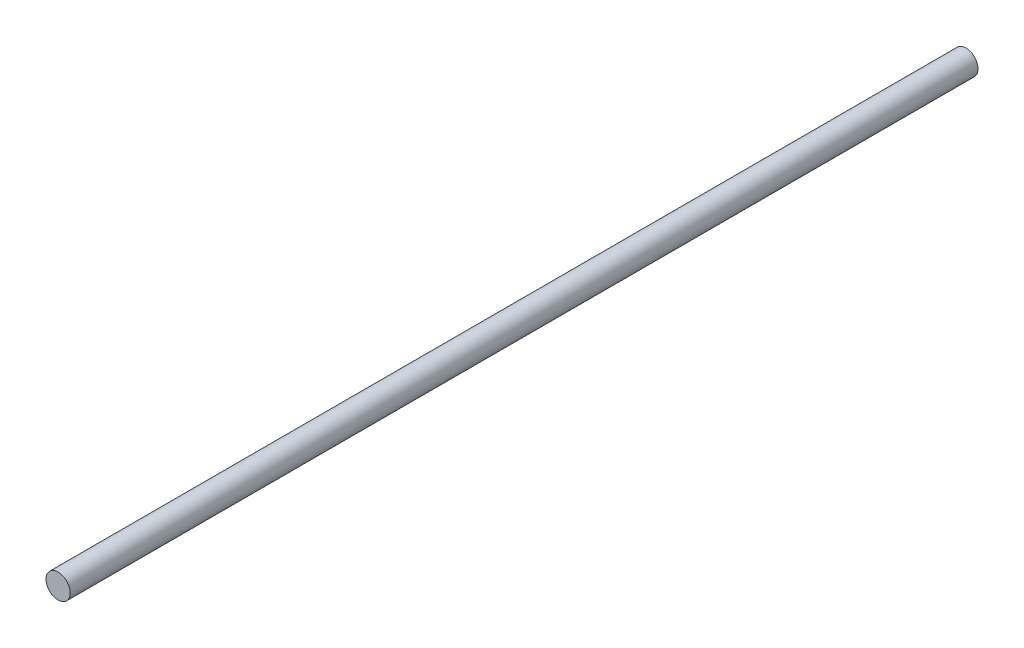
ISO-10303-21;
HEADER;
FILE_DESCRIPTION(('STEP AP214'),'2;1');
FILE_NAME('part.step','',(''),(''),'','','');
FILE_SCHEMA(('AUTOMOTIVE_DESIGN { 1 0 10303 214 1 1 1 1 }'));
ENDSEC;
DATA;
#1=APPLICATION_CONTEXT('core data for automotive mechanical design processes');
#2=APPLICATION_PROTOCOL_DEFINITION('international standard','automotive_design',2000,#1);
#3=PRODUCT_CONTEXT('',#1,'mechanical');
#4=PRODUCT('Part','Part','',(#3));
#5=PRODUCT_RELATED_PRODUCT_CATEGORY('part','',(#4));
#6=PRODUCT_DEFINITION_FORMATION('','',#4);
#7=PRODUCT_DEFINITION_CONTEXT('part definition',#1,'design');
#8=PRODUCT_DEFINITION('design','',#6,#7);
#9=PRODUCT_DEFINITION_SHAPE('','',#8);
#10=(LENGTH_UNIT() NAMED_UNIT(*) SI_UNIT(.MILLI.,.METRE.));
#11=(NAMED_UNIT(*) PLANE_ANGLE_UNIT() SI_UNIT($,.RADIAN.));
#12=(NAMED_UNIT(*) SI_UNIT($,.STERADIAN.) SOLID_ANGLE_UNIT());
#13=UNCERTAINTY_MEASURE_WITH_UNIT(LENGTH_MEASURE(1.E-05),#10,'distance_accuracy_value','');
#14=(GEOMETRIC_REPRESENTATION_CONTEXT(3) GLOBAL_UNCERTAINTY_ASSIGNED_CONTEXT((#13)) GLOBAL_UNIT_ASSIGNED_CONTEXT((#10,
#11,#12)) REPRESENTATION_CONTEXT('',''));
#15=CARTESIAN_POINT('',(0.,0.,0.));
#16=DIRECTION('',(0.,0.,1.));
#17=DIRECTION('',(1.,0.,0.));
#18=AXIS2_PLACEMENT_3D('',#15,#16,#17);
#19=CARTESIAN_POINT('',(0.,0.,37.5));
#20=DIRECTION('',(0.,0.,-1.));
#21=DIRECTION('',(-1.,0.,0.));
#22=AXIS2_PLACEMENT_3D('',#19,#20,#21);
#23=CYLINDRICAL_SURFACE('',#22,1.);
#24=CARTESIAN_POINT('',(0.,0.,37.5));
#25=DIRECTION('',(0.,0.,1.));
#26=DIRECTION('',(1.,0.,0.));
#27=AXIS2_PLACEMENT_3D('',#24,#25,#26);
#28=CIRCLE('',#27,1.);
#29=CARTESIAN_POINT('',(1.,0.,37.5));
#30=VERTEX_POINT('',#29);
#31=EDGE_CURVE('E10',#30,#30,#28,.T.);
#32=ORIENTED_EDGE('',*,*,#31,.F.);
#33=EDGE_LOOP('',(#32));
#34=FACE_BOUND('',#33,.T.);
#35=CARTESIAN_POINT('',(0.,0.,-37.5));
#36=DIRECTION('',(0.,0.,1.));
#37=DIRECTION('',(1.,0.,0.));
#38=AXIS2_PLACEMENT_3D('',#35,#36,#37);
#39=CIRCLE('',#38,1.);
#40=CARTESIAN_POINT('',(1.,0.,-37.5));
#41=VERTEX_POINT('',#40);
#42=EDGE_CURVE('E40',#41,#41,#39,.T.);
#43=ORIENTED_EDGE('',*,*,#42,.T.);
#44=EDGE_LOOP('',(#43));
#45=FACE_BOUND('',#44,.T.);
#46=ADVANCED_FACE('F37',(#34,#45),#23,.T.);
#47=CARTESIAN_POINT('',(0.,0.,37.5));
#48=DIRECTION('',(0.,0.,1.));
#49=DIRECTION('',(1.,0.,0.));
#50=AXIS2_PLACEMENT_3D('',#47,#48,#49);
#51=PLANE('',#50);
#52=ORIENTED_EDGE('',*,*,#31,.T.);
#53=EDGE_LOOP('',(#52));
#54=FACE_BOUND('',#53,.T.);
#55=ADVANCED_FACE('F52',(#54),#51,.T.);
#56=CARTESIAN_POINT('',(0.,0.,-37.5));
#57=DIRECTION('',(0.,0.,1.));
#58=DIRECTION('',(1.,0.,0.));
#59=AXIS2_PLACEMENT_3D('',#56,#57,#58);
#60=PLANE('',#59);
#61=ORIENTED_EDGE('',*,*,#42,.F.);
#62=EDGE_LOOP('',(#61));
#63=FACE_BOUND('',#62,.T.);
#64=ADVANCED_FACE('F50',(#63),#60,.F.);
#65=CLOSED_SHELL('',(#46,#55,#64));
#66=MANIFOLD_SOLID_BREP('B2',#65);
#67=ADVANCED_BREP_SHAPE_REPRESENTATION('',(#18,#66),#14);
#68=SHAPE_DEFINITION_REPRESENTATION(#9,#67);
ENDSEC;
END-ISO-10303-21;
